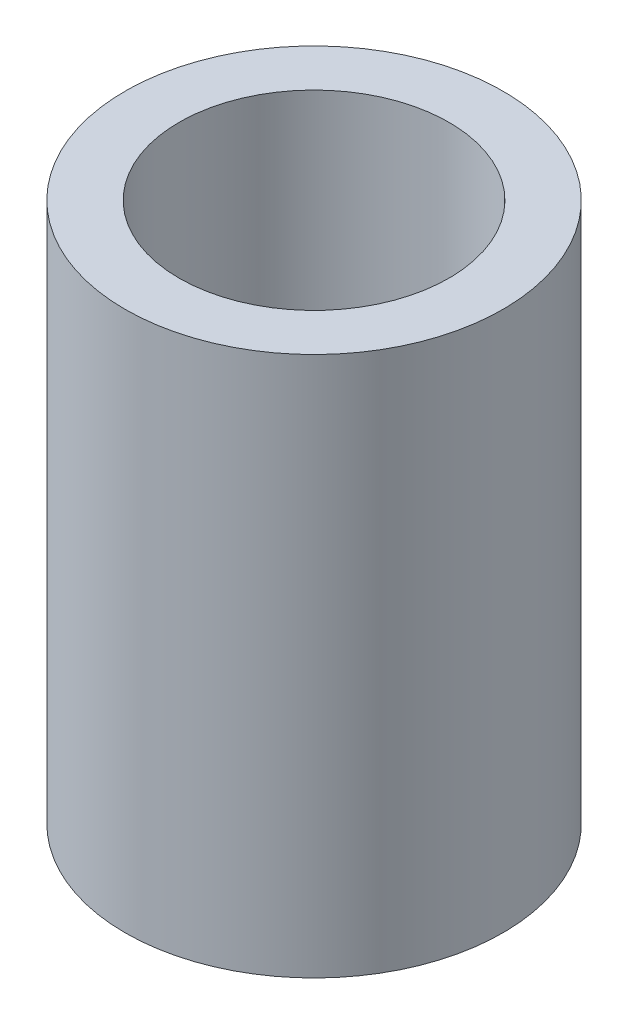
ISO-10303-21;
HEADER;
FILE_DESCRIPTION(('STEP AP214'),'2;1');
FILE_NAME('part.step','',(''),(''),'','','');
FILE_SCHEMA(('AUTOMOTIVE_DESIGN { 1 0 10303 214 1 1 1 1 }'));
ENDSEC;
DATA;
#1=APPLICATION_CONTEXT('core data for automotive mechanical design processes');
#2=APPLICATION_PROTOCOL_DEFINITION('international standard','automotive_design',2000,#1);
#3=PRODUCT_CONTEXT('',#1,'mechanical');
#4=PRODUCT('Part','Part','',(#3));
#5=PRODUCT_RELATED_PRODUCT_CATEGORY('part','',(#4));
#6=PRODUCT_DEFINITION_FORMATION('','',#4);
#7=PRODUCT_DEFINITION_CONTEXT('part definition',#1,'design');
#8=PRODUCT_DEFINITION('design','',#6,#7);
#9=PRODUCT_DEFINITION_SHAPE('','',#8);
#10=(LENGTH_UNIT() NAMED_UNIT(*) SI_UNIT(.MILLI.,.METRE.));
#11=(NAMED_UNIT(*) PLANE_ANGLE_UNIT() SI_UNIT($,.RADIAN.));
#12=(NAMED_UNIT(*) SI_UNIT($,.STERADIAN.) SOLID_ANGLE_UNIT());
#13=UNCERTAINTY_MEASURE_WITH_UNIT(LENGTH_MEASURE(1.E-05),#10,'distance_accuracy_value','');
#14=(GEOMETRIC_REPRESENTATION_CONTEXT(3) GLOBAL_UNCERTAINTY_ASSIGNED_CONTEXT((#13)) GLOBAL_UNIT_ASSIGNED_CONTEXT((#10,
#11,#12)) REPRESENTATION_CONTEXT('',''));
#15=CARTESIAN_POINT('',(0.,0.,0.));
#16=DIRECTION('',(0.,0.,1.));
#17=DIRECTION('',(1.,0.,0.));
#18=AXIS2_PLACEMENT_3D('',#15,#16,#17);
#19=CARTESIAN_POINT('',(0.,15.,0.));
#20=DIRECTION('',(0.,1.,0.));
#21=DIRECTION('',(0.,0.,1.));
#22=AXIS2_PLACEMENT_3D('',#19,#20,#21);
#23=PLANE('',#22);
#24=CARTESIAN_POINT('',(0.,15.,0.));
#25=DIRECTION('',(0.,1.,0.));
#26=DIRECTION('',(0.,0.,1.));
#27=AXIS2_PLACEMENT_3D('',#24,#25,#26);
#28=CIRCLE('',#27,10.5);
#29=CARTESIAN_POINT('',(0.,15.,10.5));
#30=VERTEX_POINT('',#29);
#31=EDGE_CURVE('E10',#30,#30,#28,.T.);
#32=ORIENTED_EDGE('',*,*,#31,.T.);
#33=EDGE_LOOP('',(#32));
#34=FACE_BOUND('',#33,.T.);
#35=CARTESIAN_POINT('',(0.,15.,0.));
#36=DIRECTION('',(0.,1.,0.));
#37=DIRECTION('',(0.,0.,1.));
#38=AXIS2_PLACEMENT_3D('',#35,#36,#37);
#39=CIRCLE('',#38,7.5);
#40=CARTESIAN_POINT('',(0.,15.,7.5));
#41=VERTEX_POINT('',#40);
#42=EDGE_CURVE('E41',#41,#41,#39,.T.);
#43=ORIENTED_EDGE('',*,*,#42,.F.);
#44=EDGE_LOOP('',(#43));
#45=FACE_BOUND('',#44,.T.);
#46=ADVANCED_FACE('F30',(#34,#45),#23,.T.);
#47=CARTESIAN_POINT('',(0.,-15.,0.));
#48=DIRECTION('',(0.,1.,0.));
#49=DIRECTION('',(0.,0.,1.));
#50=AXIS2_PLACEMENT_3D('',#47,#48,#49);
#51=PLANE('',#50);
#52=CARTESIAN_POINT('',(0.,-15.,0.));
#53=DIRECTION('',(0.,1.,0.));
#54=DIRECTION('',(0.,0.,1.));
#55=AXIS2_PLACEMENT_3D('',#52,#53,#54);
#56=CIRCLE('',#55,10.5);
#57=CARTESIAN_POINT('',(0.,-15.,10.5));
#58=VERTEX_POINT('',#57);
#59=EDGE_CURVE('E34',#58,#58,#56,.T.);
#60=ORIENTED_EDGE('',*,*,#59,.F.);
#61=EDGE_LOOP('',(#60));
#62=FACE_BOUND('',#61,.T.);
#63=CARTESIAN_POINT('',(0.,-15.,0.));
#64=DIRECTION('',(0.,1.,0.));
#65=DIRECTION('',(0.,0.,1.));
#66=AXIS2_PLACEMENT_3D('',#63,#64,#65);
#67=CIRCLE('',#66,7.5);
#68=CARTESIAN_POINT('',(0.,-15.,7.5));
#69=VERTEX_POINT('',#68);
#70=EDGE_CURVE('E43',#69,#69,#67,.T.);
#71=ORIENTED_EDGE('',*,*,#70,.T.);
#72=EDGE_LOOP('',(#71));
#73=FACE_BOUND('',#72,.T.);
#74=ADVANCED_FACE('F53',(#62,#73),#51,.F.);
#75=CARTESIAN_POINT('',(0.,15.,0.));
#76=DIRECTION('',(0.,-1.,0.));
#77=DIRECTION('',(0.,0.,-1.));
#78=AXIS2_PLACEMENT_3D('',#75,#76,#77);
#79=CYLINDRICAL_SURFACE('',#78,10.5);
#80=ORIENTED_EDGE('',*,*,#31,.F.);
#81=EDGE_LOOP('',(#80));
#82=FACE_BOUND('',#81,.T.);
#83=ORIENTED_EDGE('',*,*,#59,.T.);
#84=EDGE_LOOP('',(#83));
#85=FACE_BOUND('',#84,.T.);
#86=ADVANCED_FACE('F32',(#82,#85),#79,.T.);
#87=CARTESIAN_POINT('',(0.,15.,0.));
#88=DIRECTION('',(0.,-1.,0.));
#89=DIRECTION('',(0.,0.,-1.));
#90=AXIS2_PLACEMENT_3D('',#87,#88,#89);
#91=CYLINDRICAL_SURFACE('',#90,7.5);
#92=ORIENTED_EDGE('',*,*,#42,.T.);
#93=EDGE_LOOP('',(#92));
#94=FACE_BOUND('',#93,.T.);
#95=ORIENTED_EDGE('',*,*,#70,.F.);
#96=EDGE_LOOP('',(#95));
#97=FACE_BOUND('',#96,.T.);
#98=ADVANCED_FACE('F49',(#94,#97),#91,.F.);
#99=CLOSED_SHELL('',(#46,#74,#86,#98));
#100=MANIFOLD_SOLID_BREP('B2',#99);
#101=ADVANCED_BREP_SHAPE_REPRESENTATION('',(#18,#100),#14);
#102=SHAPE_DEFINITION_REPRESENTATION(#9,#101);
ENDSEC;
END-ISO-10303-21;
